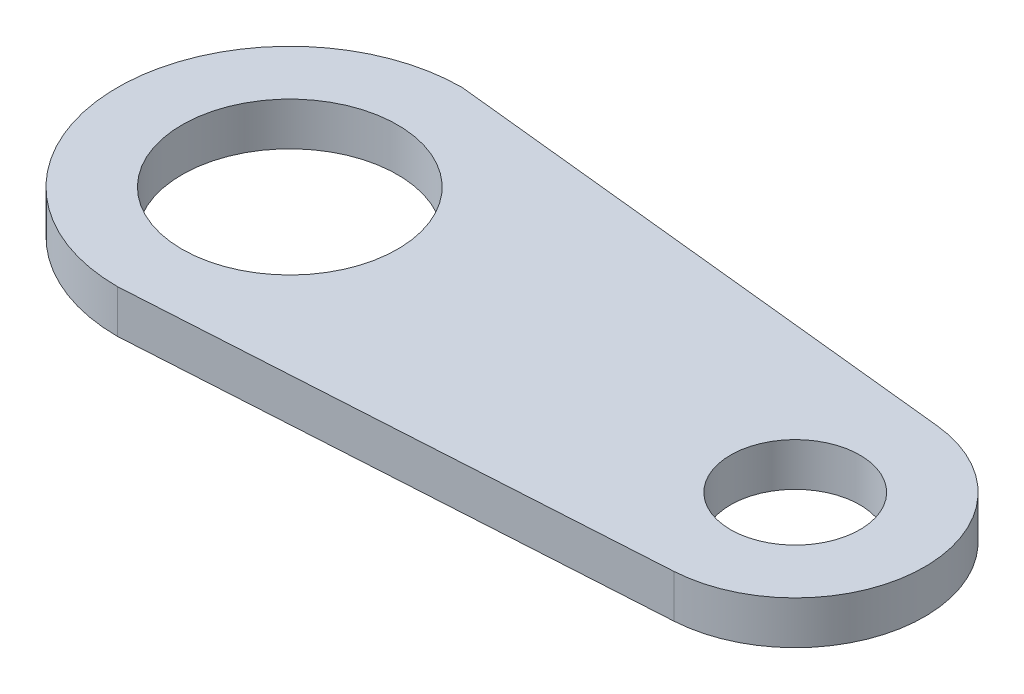
ISO-10303-21;
HEADER;
FILE_DESCRIPTION(('STEP AP214'),'2;1');
FILE_NAME('part.step','',(''),(''),'','','');
FILE_SCHEMA(('AUTOMOTIVE_DESIGN { 1 0 10303 214 1 1 1 1 }'));
ENDSEC;
DATA;
#1=APPLICATION_CONTEXT('core data for automotive mechanical design processes');
#2=APPLICATION_PROTOCOL_DEFINITION('international standard','automotive_design',2000,#1);
#3=PRODUCT_CONTEXT('',#1,'mechanical');
#4=PRODUCT('Part','Part','',(#3));
#5=PRODUCT_RELATED_PRODUCT_CATEGORY('part','',(#4));
#6=PRODUCT_DEFINITION_FORMATION('','',#4);
#7=PRODUCT_DEFINITION_CONTEXT('part definition',#1,'design');
#8=PRODUCT_DEFINITION('design','',#6,#7);
#9=PRODUCT_DEFINITION_SHAPE('','',#8);
#10=(LENGTH_UNIT() NAMED_UNIT(*) SI_UNIT(.MILLI.,.METRE.));
#11=(NAMED_UNIT(*) PLANE_ANGLE_UNIT() SI_UNIT($,.RADIAN.));
#12=(NAMED_UNIT(*) SI_UNIT($,.STERADIAN.) SOLID_ANGLE_UNIT());
#13=UNCERTAINTY_MEASURE_WITH_UNIT(LENGTH_MEASURE(1.E-05),#10,'distance_accuracy_value','');
#14=(GEOMETRIC_REPRESENTATION_CONTEXT(3) GLOBAL_UNCERTAINTY_ASSIGNED_CONTEXT((#13)) GLOBAL_UNIT_ASSIGNED_CONTEXT((#10,
#11,#12)) REPRESENTATION_CONTEXT('',''));
#15=CARTESIAN_POINT('',(0.,0.,0.));
#16=DIRECTION('',(0.,0.,1.));
#17=DIRECTION('',(1.,0.,0.));
#18=AXIS2_PLACEMENT_3D('',#15,#16,#17);
#19=CARTESIAN_POINT('',(1.20153057843724,5.,19.9275537907926));
#20=DIRECTION('',(-0.0601856333386186,0.,-0.998187201650887));
#21=DIRECTION('',(-0.998187201650887,0.,0.0601856333386186));
#22=AXIS2_PLACEMENT_3D('',#19,#20,#21);
#23=PLANE('',#22);
#24=DIRECTION('',(0.998187201650887,0.,-0.0601856333386186));
#25=VECTOR('',#24,1.);
#26=CARTESIAN_POINT('',(1.20153057843724,0.,19.9275537907926));
#27=LINE('',#26,#25);
#28=CARTESIAN_POINT('',(0.,0.,20.));
#29=VERTEX_POINT('',#28);
#30=CARTESIAN_POINT('',(60.8874600487628,0.,16.3287944993145));
#31=VERTEX_POINT('',#30);
#32=EDGE_CURVE('E113',#29,#31,#27,.T.);
#33=ORIENTED_EDGE('',*,*,#32,.T.);
#34=DIRECTION('',(0.,-1.,0.));
#35=VECTOR('',#34,1.);
#36=CARTESIAN_POINT('',(60.8874600487628,5.,16.3287944993145));
#37=LINE('',#36,#35);
#38=CARTESIAN_POINT('',(60.8874600487628,5.,16.3287944993145));
#39=VERTEX_POINT('',#38);
#40=EDGE_CURVE('E11',#39,#31,#37,.T.);
#41=ORIENTED_EDGE('',*,*,#40,.F.);
#42=DIRECTION('',(0.998187201650887,0.,-0.0601856333386186));
#43=VECTOR('',#42,1.);
#44=CARTESIAN_POINT('',(1.20153057843724,5.,19.9275537907926));
#45=LINE('',#44,#43);
#46=CARTESIAN_POINT('',(0.,5.,20.));
#47=VERTEX_POINT('',#46);
#48=EDGE_CURVE('E93',#47,#39,#45,.T.);
#49=ORIENTED_EDGE('',*,*,#48,.F.);
#50=DIRECTION('',(0.,-1.,0.));
#51=VECTOR('',#50,1.);
#52=CARTESIAN_POINT('',(0.,5.,20.));
#53=LINE('',#52,#51);
#54=EDGE_CURVE('E109',#47,#29,#53,.T.);
#55=ORIENTED_EDGE('',*,*,#54,.T.);
#56=EDGE_LOOP('',(#33,#41,#49,#55));
#57=FACE_BOUND('',#56,.T.);
#58=ADVANCED_FACE('F43',(#57),#23,.F.);
#59=CARTESIAN_POINT('',(59.9846755486835,5.,1.35598647455117));
#60=DIRECTION('',(0.,-1.,0.));
#61=DIRECTION('',(0.,0.,-1.));
#62=AXIS2_PLACEMENT_3D('',#59,#60,#61);
#63=CYLINDRICAL_SURFACE('',#62,15.);
#64=CARTESIAN_POINT('',(59.9846755486835,0.,1.35598647455117));
#65=DIRECTION('',(0.,1.,0.));
#66=DIRECTION('',(0.,0.,1.));
#67=AXIS2_PLACEMENT_3D('',#64,#65,#66);
#68=CIRCLE('',#67,15.);
#69=CARTESIAN_POINT('',(61.545103008269,0.,-13.5626282782793));
#70=VERTEX_POINT('',#69);
#71=EDGE_CURVE('E99',#31,#70,#68,.T.);
#72=ORIENTED_EDGE('',*,*,#71,.T.);
#73=DIRECTION('',(0.,-1.,0.));
#74=VECTOR('',#73,1.);
#75=CARTESIAN_POINT('',(61.545103008269,5.,-13.5626282782793));
#76=LINE('',#75,#74);
#77=CARTESIAN_POINT('',(61.545103008269,5.,-13.5626282782793));
#78=VERTEX_POINT('',#77);
#79=EDGE_CURVE('E53',#78,#70,#76,.T.);
#80=ORIENTED_EDGE('',*,*,#79,.F.);
#81=CARTESIAN_POINT('',(59.9846755486835,5.,1.35598647455117));
#82=DIRECTION('',(0.,1.,0.));
#83=DIRECTION('',(0.,0.,1.));
#84=AXIS2_PLACEMENT_3D('',#81,#82,#83);
#85=CIRCLE('',#84,15.);
#86=EDGE_CURVE('E88',#39,#78,#85,.T.);
#87=ORIENTED_EDGE('',*,*,#86,.F.);
#88=ORIENTED_EDGE('',*,*,#40,.T.);
#89=EDGE_LOOP('',(#72,#80,#87,#88));
#90=FACE_BOUND('',#89,.T.);
#91=ADVANCED_FACE('F98',(#90),#63,.T.);
#92=CARTESIAN_POINT('',(2.06928143282602,5.,-19.7835614349664));
#93=DIRECTION('',(0.104028497305694,0.,-0.994574316855367));
#94=DIRECTION('',(-0.994574316855367,0.,-0.104028497305694));
#95=AXIS2_PLACEMENT_3D('',#92,#93,#94);
#96=PLANE('',#95);
#97=DIRECTION('',(0.994574316855367,0.,0.104028497305694));
#98=VECTOR('',#97,1.);
#99=CARTESIAN_POINT('',(2.06928143282602,0.,-19.7835614349664));
#100=LINE('',#99,#98);
#101=CARTESIAN_POINT('',(0.,0.,-20.));
#102=VERTEX_POINT('',#101);
#103=EDGE_CURVE('E119',#102,#70,#100,.T.);
#104=ORIENTED_EDGE('',*,*,#103,.F.);
#105=DIRECTION('',(0.,-1.,0.));
#106=VECTOR('',#105,1.);
#107=CARTESIAN_POINT('',(0.,5.,-20.));
#108=LINE('',#107,#106);
#109=CARTESIAN_POINT('',(0.,5.,-20.));
#110=VERTEX_POINT('',#109);
#111=EDGE_CURVE('E78',#110,#102,#108,.T.);
#112=ORIENTED_EDGE('',*,*,#111,.F.);
#113=DIRECTION('',(0.994574316855367,0.,0.104028497305694));
#114=VECTOR('',#113,1.);
#115=CARTESIAN_POINT('',(2.06928143282602,5.,-19.7835614349664));
#116=LINE('',#115,#114);
#117=EDGE_CURVE('E91',#110,#78,#116,.T.);
#118=ORIENTED_EDGE('',*,*,#117,.T.);
#119=ORIENTED_EDGE('',*,*,#79,.T.);
#120=EDGE_LOOP('',(#104,#112,#118,#119));
#121=FACE_BOUND('',#120,.T.);
#122=ADVANCED_FACE('F105',(#121),#96,.T.);
#123=CARTESIAN_POINT('',(0.,5.,0.));
#124=DIRECTION('',(0.,-1.,0.));
#125=DIRECTION('',(0.,0.,-1.));
#126=AXIS2_PLACEMENT_3D('',#123,#124,#125);
#127=CYLINDRICAL_SURFACE('',#126,20.);
#128=CARTESIAN_POINT('',(0.,0.,0.));
#129=DIRECTION('',(0.,1.,0.));
#130=DIRECTION('',(0.,0.,1.));
#131=AXIS2_PLACEMENT_3D('',#128,#129,#130);
#132=CIRCLE('',#131,20.);
#133=EDGE_CURVE('E81',#102,#29,#132,.T.);
#134=ORIENTED_EDGE('',*,*,#133,.T.);
#135=ORIENTED_EDGE('',*,*,#54,.F.);
#136=CARTESIAN_POINT('',(0.,5.,0.));
#137=DIRECTION('',(0.,1.,0.));
#138=DIRECTION('',(0.,0.,1.));
#139=AXIS2_PLACEMENT_3D('',#136,#137,#138);
#140=CIRCLE('',#139,20.);
#141=EDGE_CURVE('E62',#110,#47,#140,.T.);
#142=ORIENTED_EDGE('',*,*,#141,.F.);
#143=ORIENTED_EDGE('',*,*,#111,.T.);
#144=EDGE_LOOP('',(#134,#135,#142,#143));
#145=FACE_BOUND('',#144,.T.);
#146=ADVANCED_FACE('F152',(#145),#127,.T.);
#147=CARTESIAN_POINT('',(0.,5.,0.));
#148=DIRECTION('',(0.,1.,0.));
#149=DIRECTION('',(0.,0.,1.));
#150=AXIS2_PLACEMENT_3D('',#147,#148,#149);
#151=PLANE('',#150);
#152=CARTESIAN_POINT('',(0.,5.,0.));
#153=DIRECTION('',(0.,1.,0.));
#154=DIRECTION('',(0.,0.,1.));
#155=AXIS2_PLACEMENT_3D('',#152,#153,#154);
#156=CIRCLE('',#155,12.5);
#157=CARTESIAN_POINT('',(0.,5.,12.5));
#158=VERTEX_POINT('',#157);
#159=EDGE_CURVE('E130',#158,#158,#156,.T.);
#160=ORIENTED_EDGE('',*,*,#159,.F.);
#161=EDGE_LOOP('',(#160));
#162=FACE_BOUND('',#161,.T.);
#163=CARTESIAN_POINT('',(59.9846755486835,5.,1.35598647455117));
#164=DIRECTION('',(0.,1.,0.));
#165=DIRECTION('',(0.,0.,1.));
#166=AXIS2_PLACEMENT_3D('',#163,#164,#165);
#167=CIRCLE('',#166,7.50000000000001);
#168=CARTESIAN_POINT('',(59.9846755486835,5.,8.85598647455117));
#169=VERTEX_POINT('',#168);
#170=EDGE_CURVE('E137',#169,#169,#167,.T.);
#171=ORIENTED_EDGE('',*,*,#170,.F.);
#172=EDGE_LOOP('',(#171));
#173=FACE_BOUND('',#172,.T.);
#174=ORIENTED_EDGE('',*,*,#48,.T.);
#175=ORIENTED_EDGE('',*,*,#86,.T.);
#176=ORIENTED_EDGE('',*,*,#117,.F.);
#177=ORIENTED_EDGE('',*,*,#141,.T.);
#178=EDGE_LOOP('',(#174,#175,#176,#177));
#179=FACE_BOUND('',#178,.T.);
#180=ADVANCED_FACE('F89',(#162,#173,#179),#151,.T.);
#181=CARTESIAN_POINT('',(0.,0.,0.));
#182=DIRECTION('',(0.,1.,0.));
#183=DIRECTION('',(0.,0.,1.));
#184=AXIS2_PLACEMENT_3D('',#181,#182,#183);
#185=PLANE('',#184);
#186=CARTESIAN_POINT('',(0.,0.,0.));
#187=DIRECTION('',(0.,1.,0.));
#188=DIRECTION('',(0.,0.,1.));
#189=AXIS2_PLACEMENT_3D('',#186,#187,#188);
#190=CIRCLE('',#189,12.5);
#191=CARTESIAN_POINT('',(0.,0.,12.5));
#192=VERTEX_POINT('',#191);
#193=EDGE_CURVE('E46',#192,#192,#190,.T.);
#194=ORIENTED_EDGE('',*,*,#193,.T.);
#195=EDGE_LOOP('',(#194));
#196=FACE_BOUND('',#195,.T.);
#197=CARTESIAN_POINT('',(59.9846755486835,0.,1.35598647455117));
#198=DIRECTION('',(0.,1.,0.));
#199=DIRECTION('',(0.,0.,1.));
#200=AXIS2_PLACEMENT_3D('',#197,#198,#199);
#201=CIRCLE('',#200,7.50000000000001);
#202=CARTESIAN_POINT('',(59.9846755486835,0.,8.85598647455117));
#203=VERTEX_POINT('',#202);
#204=EDGE_CURVE('E127',#203,#203,#201,.T.);
#205=ORIENTED_EDGE('',*,*,#204,.T.);
#206=EDGE_LOOP('',(#205));
#207=FACE_BOUND('',#206,.T.);
#208=ORIENTED_EDGE('',*,*,#32,.F.);
#209=ORIENTED_EDGE('',*,*,#133,.F.);
#210=ORIENTED_EDGE('',*,*,#103,.T.);
#211=ORIENTED_EDGE('',*,*,#71,.F.);
#212=EDGE_LOOP('',(#208,#209,#210,#211));
#213=FACE_BOUND('',#212,.T.);
#214=ADVANCED_FACE('F151',(#196,#207,#213),#185,.F.);
#215=CARTESIAN_POINT('',(59.9846755486835,-5.,1.35598647455117));
#216=DIRECTION('',(0.,1.,0.));
#217=DIRECTION('',(0.,0.,1.));
#218=AXIS2_PLACEMENT_3D('',#215,#216,#217);
#219=CYLINDRICAL_SURFACE('',#218,7.50000000000001);
#220=ORIENTED_EDGE('',*,*,#170,.T.);
#221=EDGE_LOOP('',(#220));
#222=FACE_BOUND('',#221,.T.);
#223=ORIENTED_EDGE('',*,*,#204,.F.);
#224=EDGE_LOOP('',(#223));
#225=FACE_BOUND('',#224,.T.);
#226=ADVANCED_FACE('F147',(#222,#225),#219,.F.);
#227=CARTESIAN_POINT('',(0.,-5.,0.));
#228=DIRECTION('',(0.,1.,0.));
#229=DIRECTION('',(0.,0.,1.));
#230=AXIS2_PLACEMENT_3D('',#227,#228,#229);
#231=CYLINDRICAL_SURFACE('',#230,12.5);
#232=ORIENTED_EDGE('',*,*,#159,.T.);
#233=EDGE_LOOP('',(#232));
#234=FACE_BOUND('',#233,.T.);
#235=ORIENTED_EDGE('',*,*,#193,.F.);
#236=EDGE_LOOP('',(#235));
#237=FACE_BOUND('',#236,.T.);
#238=ADVANCED_FACE('F199',(#234,#237),#231,.F.);
#239=CLOSED_SHELL('',(#58,#91,#122,#146,#180,#214,#226,#238));
#240=MANIFOLD_SOLID_BREP('B2',#239);
#241=ADVANCED_BREP_SHAPE_REPRESENTATION('',(#18,#240),#14);
#242=SHAPE_DEFINITION_REPRESENTATION(#9,#241);
ENDSEC;
END-ISO-10303-21;
